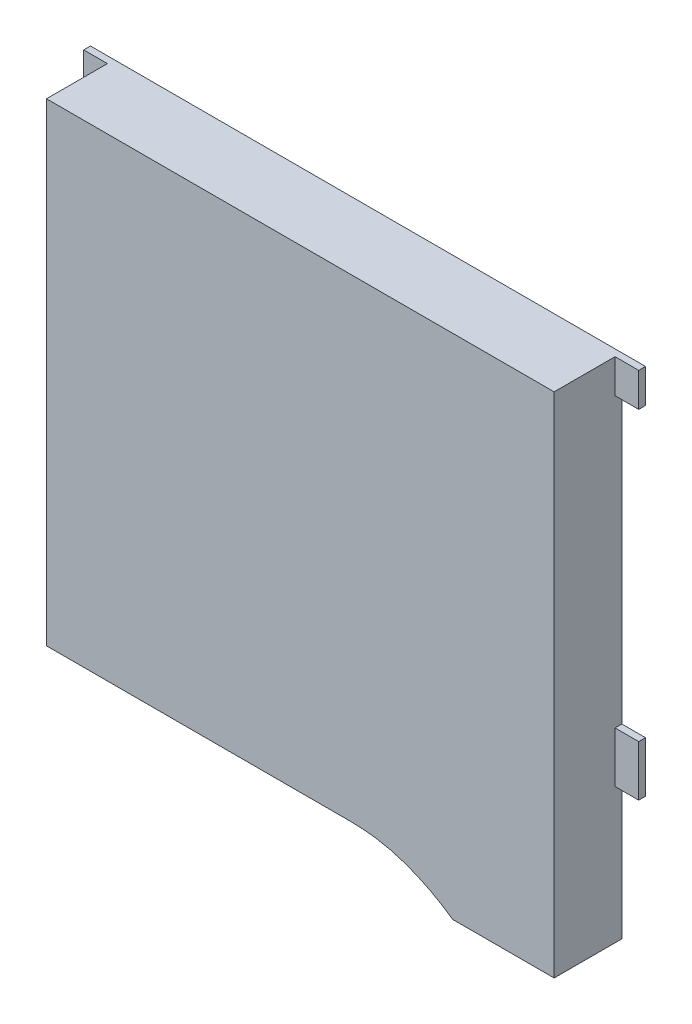
ISO-10303-21;
HEADER;
FILE_DESCRIPTION(('STEP AP214'),'2;1');
FILE_NAME('part.step','',(''),(''),'','','');
FILE_SCHEMA(('AUTOMOTIVE_DESIGN { 1 0 10303 214 1 1 1 1 }'));
ENDSEC;
DATA;
#1=APPLICATION_CONTEXT('core data for automotive mechanical design processes');
#2=APPLICATION_PROTOCOL_DEFINITION('international standard','automotive_design',2000,#1);
#3=PRODUCT_CONTEXT('',#1,'mechanical');
#4=PRODUCT('Part','Part','',(#3));
#5=PRODUCT_RELATED_PRODUCT_CATEGORY('part','',(#4));
#6=PRODUCT_DEFINITION_FORMATION('','',#4);
#7=PRODUCT_DEFINITION_CONTEXT('part definition',#1,'design');
#8=PRODUCT_DEFINITION('design','',#6,#7);
#9=PRODUCT_DEFINITION_SHAPE('','',#8);
#10=(LENGTH_UNIT() NAMED_UNIT(*) SI_UNIT(.MILLI.,.METRE.));
#11=(NAMED_UNIT(*) PLANE_ANGLE_UNIT() SI_UNIT($,.RADIAN.));
#12=(NAMED_UNIT(*) SI_UNIT($,.STERADIAN.) SOLID_ANGLE_UNIT());
#13=UNCERTAINTY_MEASURE_WITH_UNIT(LENGTH_MEASURE(1.E-05),#10,'distance_accuracy_value','');
#14=(GEOMETRIC_REPRESENTATION_CONTEXT(3) GLOBAL_UNCERTAINTY_ASSIGNED_CONTEXT((#13)) GLOBAL_UNIT_ASSIGNED_CONTEXT((#10,
#11,#12)) REPRESENTATION_CONTEXT('',''));
#15=CARTESIAN_POINT('',(0.,0.,0.));
#16=DIRECTION('',(0.,0.,1.));
#17=DIRECTION('',(1.,0.,0.));
#18=AXIS2_PLACEMENT_3D('',#15,#16,#17);
#19=CARTESIAN_POINT('',(7.5,7.5,2.));
#20=DIRECTION('',(-1.,0.,0.));
#21=DIRECTION('',(0.,-1.,0.));
#22=AXIS2_PLACEMENT_3D('',#19,#20,#21);
#23=PLANE('',#22);
#24=DIRECTION('',(0.,0.,-1.));
#25=VECTOR('',#24,1.);
#26=CARTESIAN_POINT('',(7.5,-3.5,0.2));
#27=LINE('',#26,#25);
#28=CARTESIAN_POINT('',(7.5,-3.5,0.2));
#29=VERTEX_POINT('',#28);
#30=CARTESIAN_POINT('',(7.5,-3.5,0.));
#31=VERTEX_POINT('',#30);
#32=EDGE_CURVE('E53',#29,#31,#27,.T.);
#33=ORIENTED_EDGE('',*,*,#32,.F.);
#34=DIRECTION('',(0.,-1.,0.));
#35=VECTOR('',#34,1.);
#36=CARTESIAN_POINT('',(7.5,-2.,0.2));
#37=LINE('',#36,#35);
#38=CARTESIAN_POINT('',(7.5,-2.,0.2));
#39=VERTEX_POINT('',#38);
#40=EDGE_CURVE('E48',#39,#29,#37,.T.);
#41=ORIENTED_EDGE('',*,*,#40,.F.);
#42=DIRECTION('',(0.,0.,-1.));
#43=VECTOR('',#42,1.);
#44=CARTESIAN_POINT('',(7.5,-2.,0.2));
#45=LINE('',#44,#43);
#46=CARTESIAN_POINT('',(7.5,-2.,0.));
#47=VERTEX_POINT('',#46);
#48=EDGE_CURVE('E220',#39,#47,#45,.T.);
#49=ORIENTED_EDGE('',*,*,#48,.T.);
#50=DIRECTION('',(0.,1.,0.));
#51=VECTOR('',#50,1.);
#52=CARTESIAN_POINT('',(7.5,7.5,0.));
#53=LINE('',#52,#51);
#54=CARTESIAN_POINT('',(7.5,6.5,0.));
#55=VERTEX_POINT('',#54);
#56=EDGE_CURVE('E655',#47,#55,#53,.T.);
#57=ORIENTED_EDGE('',*,*,#56,.T.);
#58=DIRECTION('',(0.,0.,-1.));
#59=VECTOR('',#58,1.);
#60=CARTESIAN_POINT('',(7.5,6.5,0.2));
#61=LINE('',#60,#59);
#62=CARTESIAN_POINT('',(7.5,6.5,0.2));
#63=VERTEX_POINT('',#62);
#64=EDGE_CURVE('E305',#63,#55,#61,.T.);
#65=ORIENTED_EDGE('',*,*,#64,.F.);
#66=DIRECTION('',(0.,-1.,0.));
#67=VECTOR('',#66,1.);
#68=CARTESIAN_POINT('',(7.5,6.5,0.2));
#69=LINE('',#68,#67);
#70=CARTESIAN_POINT('',(7.5,7.5,0.2));
#71=VERTEX_POINT('',#70);
#72=EDGE_CURVE('E285',#71,#63,#69,.T.);
#73=ORIENTED_EDGE('',*,*,#72,.F.);
#74=DIRECTION('',(0.,0.,-1.));
#75=VECTOR('',#74,1.);
#76=CARTESIAN_POINT('',(7.5,7.5,2.));
#77=LINE('',#76,#75);
#78=CARTESIAN_POINT('',(7.5,7.5,2.));
#79=VERTEX_POINT('',#78);
#80=EDGE_CURVE('E661',#79,#71,#77,.T.);
#81=ORIENTED_EDGE('',*,*,#80,.F.);
#82=DIRECTION('',(0.,1.,0.));
#83=VECTOR('',#82,1.);
#84=CARTESIAN_POINT('',(7.5,7.5,2.));
#85=LINE('',#84,#83);
#86=CARTESIAN_POINT('',(7.5,-7.5,2.));
#87=VERTEX_POINT('',#86);
#88=EDGE_CURVE('E660',#87,#79,#85,.T.);
#89=ORIENTED_EDGE('',*,*,#88,.F.);
#90=DIRECTION('',(0.,0.,-1.));
#91=VECTOR('',#90,1.);
#92=CARTESIAN_POINT('',(7.5,-7.5,2.));
#93=LINE('',#92,#91);
#94=CARTESIAN_POINT('',(7.5,-7.5,0.));
#95=VERTEX_POINT('',#94);
#96=EDGE_CURVE('E647',#87,#95,#93,.T.);
#97=ORIENTED_EDGE('',*,*,#96,.T.);
#98=EDGE_CURVE('E658',#95,#31,#53,.T.);
#99=ORIENTED_EDGE('',*,*,#98,.T.);
#100=EDGE_LOOP('',(#33,#41,#49,#57,#65,#73,#81,#89,#97,#99));
#101=FACE_BOUND('',#100,.T.);
#102=ADVANCED_FACE('F33',(#101),#23,.F.);
#103=CARTESIAN_POINT('',(-7.5,7.5,2.));
#104=DIRECTION('',(1.,0.,0.));
#105=DIRECTION('',(0.,1.,0.));
#106=AXIS2_PLACEMENT_3D('',#103,#104,#105);
#107=PLANE('',#106);
#108=DIRECTION('',(0.,0.,-1.));
#109=VECTOR('',#108,1.);
#110=CARTESIAN_POINT('',(-7.5,-2.,0.2));
#111=LINE('',#110,#109);
#112=CARTESIAN_POINT('',(-7.5,-2.,0.2));
#113=VERTEX_POINT('',#112);
#114=CARTESIAN_POINT('',(-7.5,-2.,0.));
#115=VERTEX_POINT('',#114);
#116=EDGE_CURVE('E259',#113,#115,#111,.T.);
#117=ORIENTED_EDGE('',*,*,#116,.F.);
#118=DIRECTION('',(0.,1.,0.));
#119=VECTOR('',#118,1.);
#120=CARTESIAN_POINT('',(-7.5,-2.,0.2));
#121=LINE('',#120,#119);
#122=CARTESIAN_POINT('',(-7.5,-3.5,0.2));
#123=VERTEX_POINT('',#122);
#124=EDGE_CURVE('E234',#123,#113,#121,.T.);
#125=ORIENTED_EDGE('',*,*,#124,.F.);
#126=DIRECTION('',(0.,0.,-1.));
#127=VECTOR('',#126,1.);
#128=CARTESIAN_POINT('',(-7.5,-3.5,0.2));
#129=LINE('',#128,#127);
#130=CARTESIAN_POINT('',(-7.5,-3.5,0.));
#131=VERTEX_POINT('',#130);
#132=EDGE_CURVE('E245',#123,#131,#129,.T.);
#133=ORIENTED_EDGE('',*,*,#132,.T.);
#134=DIRECTION('',(0.,-1.,0.));
#135=VECTOR('',#134,1.);
#136=CARTESIAN_POINT('',(-7.5,7.5,0.));
#137=LINE('',#136,#135);
#138=CARTESIAN_POINT('',(-7.5,-6.5,0.));
#139=VERTEX_POINT('',#138);
#140=EDGE_CURVE('E339',#131,#139,#137,.T.);
#141=ORIENTED_EDGE('',*,*,#140,.T.);
#142=DIRECTION('',(0.,0.,-1.));
#143=VECTOR('',#142,1.);
#144=CARTESIAN_POINT('',(-7.5,-6.5,2.));
#145=LINE('',#144,#143);
#146=CARTESIAN_POINT('',(-7.5,-6.5,2.));
#147=VERTEX_POINT('',#146);
#148=EDGE_CURVE('E681',#147,#139,#145,.T.);
#149=ORIENTED_EDGE('',*,*,#148,.F.);
#150=DIRECTION('',(0.,-1.,0.));
#151=VECTOR('',#150,1.);
#152=CARTESIAN_POINT('',(-7.5,7.5,2.));
#153=LINE('',#152,#151);
#154=CARTESIAN_POINT('',(-7.5,7.5,2.));
#155=VERTEX_POINT('',#154);
#156=EDGE_CURVE('E340',#155,#147,#153,.T.);
#157=ORIENTED_EDGE('',*,*,#156,.F.);
#158=DIRECTION('',(0.,0.,-1.));
#159=VECTOR('',#158,1.);
#160=CARTESIAN_POINT('',(-7.5,7.5,2.));
#161=LINE('',#160,#159);
#162=CARTESIAN_POINT('',(-7.5,7.5,0.2));
#163=VERTEX_POINT('',#162);
#164=EDGE_CURVE('E668',#155,#163,#161,.T.);
#165=ORIENTED_EDGE('',*,*,#164,.T.);
#166=DIRECTION('',(0.,1.,0.));
#167=VECTOR('',#166,1.);
#168=CARTESIAN_POINT('',(-7.5,7.5,0.2));
#169=LINE('',#168,#167);
#170=CARTESIAN_POINT('',(-7.5,6.5,0.2));
#171=VERTEX_POINT('',#170);
#172=EDGE_CURVE('E263',#171,#163,#169,.T.);
#173=ORIENTED_EDGE('',*,*,#172,.F.);
#174=DIRECTION('',(0.,0.,-1.));
#175=VECTOR('',#174,1.);
#176=CARTESIAN_POINT('',(-7.5,6.5,0.2));
#177=LINE('',#176,#175);
#178=CARTESIAN_POINT('',(-7.5,6.5,0.));
#179=VERTEX_POINT('',#178);
#180=EDGE_CURVE('E273',#171,#179,#177,.T.);
#181=ORIENTED_EDGE('',*,*,#180,.T.);
#182=EDGE_CURVE('E702',#179,#115,#137,.T.);
#183=ORIENTED_EDGE('',*,*,#182,.T.);
#184=EDGE_LOOP('',(#117,#125,#133,#141,#149,#157,#165,#173,#181,#183));
#185=FACE_BOUND('',#184,.T.);
#186=ADVANCED_FACE('F35',(#185),#107,.F.);
#187=CARTESIAN_POINT('',(1.5,-6.5,2.));
#188=CARTESIAN_POINT('',(3.08113883008419,-6.5,2.));
#189=CARTESIAN_POINT('',(4.5,-7.5,2.));
#190=B_SPLINE_CURVE_WITH_KNOTS('',2,(#187,#188,#189),.UNSPECIFIED.,.F.,.F.,(3,3),(0.,1.),.UNSPECIFIED.);
#191=DIRECTION('',(0.,0.,-1.));
#192=VECTOR('',#191,1.);
#193=SURFACE_OF_LINEAR_EXTRUSION('',#190,#192);
#194=DIRECTION('',(0.,0.,-1.));
#195=VECTOR('',#194,1.);
#196=CARTESIAN_POINT('',(1.5,-6.5,2.));
#197=LINE('',#196,#195);
#198=CARTESIAN_POINT('',(1.5,-6.5,2.));
#199=VERTEX_POINT('',#198);
#200=CARTESIAN_POINT('',(1.5,-6.5,1.8));
#201=VERTEX_POINT('',#200);
#202=EDGE_CURVE('E678',#199,#201,#197,.T.);
#203=ORIENTED_EDGE('',*,*,#202,.T.);
#204=CARTESIAN_POINT('',(1.5,-6.5,1.8));
#205=CARTESIAN_POINT('',(3.08113883008419,-6.5,1.8));
#206=CARTESIAN_POINT('',(4.5,-7.5,1.8));
#207=B_SPLINE_CURVE_WITH_KNOTS('',2,(#204,#205,#206),.UNSPECIFIED.,.F.,.F.,(3,3),(0.,1.),.UNSPECIFIED.);
#208=CARTESIAN_POINT('',(4.5,-7.5,1.8));
#209=VERTEX_POINT('',#208);
#210=EDGE_CURVE('E41',#201,#209,#207,.T.);
#211=ORIENTED_EDGE('',*,*,#210,.T.);
#212=DIRECTION('',(0.,0.,-1.));
#213=VECTOR('',#212,1.);
#214=CARTESIAN_POINT('',(4.5,-7.5,2.));
#215=LINE('',#214,#213);
#216=CARTESIAN_POINT('',(4.5,-7.5,2.));
#217=VERTEX_POINT('',#216);
#218=EDGE_CURVE('E674',#217,#209,#215,.T.);
#219=ORIENTED_EDGE('',*,*,#218,.F.);
#220=EDGE_CURVE('E346',#199,#217,#190,.T.);
#221=ORIENTED_EDGE('',*,*,#220,.F.);
#222=EDGE_LOOP('',(#203,#211,#219,#221));
#223=FACE_BOUND('',#222,.T.);
#224=ADVANCED_FACE('F363',(#223),#193,.F.);
#225=CARTESIAN_POINT('',(-7.5,-6.5,2.));
#226=DIRECTION('',(0.,1.,0.));
#227=DIRECTION('',(-1.,0.,0.));
#228=AXIS2_PLACEMENT_3D('',#225,#226,#227);
#229=PLANE('',#228);
#230=DIRECTION('',(0.,0.,1.));
#231=VECTOR('',#230,1.);
#232=CARTESIAN_POINT('',(-6.5,-6.5,2.));
#233=LINE('',#232,#231);
#234=CARTESIAN_POINT('',(-6.5,-6.5,0.7));
#235=VERTEX_POINT('',#234);
#236=CARTESIAN_POINT('',(-6.5,-6.5,1.8));
#237=VERTEX_POINT('',#236);
#238=EDGE_CURVE('E11',#235,#237,#233,.T.);
#239=ORIENTED_EDGE('',*,*,#238,.T.);
#240=DIRECTION('',(1.,0.,0.));
#241=VECTOR('',#240,1.);
#242=CARTESIAN_POINT('',(-7.5,-6.5,1.8));
#243=LINE('',#242,#241);
#244=EDGE_CURVE('E336',#237,#201,#243,.T.);
#245=ORIENTED_EDGE('',*,*,#244,.T.);
#246=ORIENTED_EDGE('',*,*,#202,.F.);
#247=DIRECTION('',(1.,0.,0.));
#248=VECTOR('',#247,1.);
#249=CARTESIAN_POINT('',(-7.5,-6.5,2.));
#250=LINE('',#249,#248);
#251=EDGE_CURVE('E343',#147,#199,#250,.T.);
#252=ORIENTED_EDGE('',*,*,#251,.F.);
#253=ORIENTED_EDGE('',*,*,#148,.T.);
#254=DIRECTION('',(1.,0.,0.));
#255=VECTOR('',#254,1.);
#256=CARTESIAN_POINT('',(-7.5,-6.5,0.));
#257=LINE('',#256,#255);
#258=CARTESIAN_POINT('',(1.5,-6.5,0.));
#259=VERTEX_POINT('',#258);
#260=EDGE_CURVE('E704',#139,#259,#257,.T.);
#261=ORIENTED_EDGE('',*,*,#260,.T.);
#262=CARTESIAN_POINT('',(1.5,-6.5,0.7));
#263=VERTEX_POINT('',#262);
#264=EDGE_CURVE('E677',#263,#259,#197,.T.);
#265=ORIENTED_EDGE('',*,*,#264,.F.);
#266=DIRECTION('',(-1.,0.,0.));
#267=VECTOR('',#266,1.);
#268=CARTESIAN_POINT('',(-7.5,-6.5,0.7));
#269=LINE('',#268,#267);
#270=EDGE_CURVE('E327',#263,#235,#269,.T.);
#271=ORIENTED_EDGE('',*,*,#270,.T.);
#272=EDGE_LOOP('',(#239,#245,#246,#252,#253,#261,#265,#271));
#273=FACE_BOUND('',#272,.T.);
#274=ADVANCED_FACE('F361',(#273),#229,.F.);
#275=CARTESIAN_POINT('',(4.5,-7.5,0.7));
#276=VERTEX_POINT('',#275);
#277=CARTESIAN_POINT('',(4.5,-7.5,0.));
#278=VERTEX_POINT('',#277);
#279=EDGE_CURVE('E651',#276,#278,#215,.T.);
#280=ORIENTED_EDGE('',*,*,#279,.F.);
#281=CARTESIAN_POINT('',(1.5,-6.5,0.7));
#282=CARTESIAN_POINT('',(3.08113883008419,-6.5,0.7));
#283=CARTESIAN_POINT('',(4.5,-7.5,0.7));
#284=B_SPLINE_CURVE_WITH_KNOTS('',2,(#281,#282,#283),.UNSPECIFIED.,.F.,.F.,(3,3),(0.,1.),.UNSPECIFIED.);
#285=EDGE_CURVE('E684',#276,#263,#284,.F.);
#286=ORIENTED_EDGE('',*,*,#285,.T.);
#287=ORIENTED_EDGE('',*,*,#264,.T.);
#288=CARTESIAN_POINT('',(1.5,-6.5,0.));
#289=CARTESIAN_POINT('',(3.08113883008419,-6.5,0.));
#290=CARTESIAN_POINT('',(4.5,-7.5,0.));
#291=B_SPLINE_CURVE_WITH_KNOTS('',2,(#288,#289,#290),.UNSPECIFIED.,.F.,.F.,(3,3),(0.,1.),.UNSPECIFIED.);
#292=EDGE_CURVE('E656',#259,#278,#291,.T.);
#293=ORIENTED_EDGE('',*,*,#292,.T.);
#294=EDGE_LOOP('',(#280,#286,#287,#293));
#295=FACE_BOUND('',#294,.T.);
#296=ADVANCED_FACE('F357',(#295),#193,.F.);
#297=CARTESIAN_POINT('',(7.5,-7.5,2.));
#298=DIRECTION('',(0.,1.,0.));
#299=DIRECTION('',(-1.,0.,0.));
#300=AXIS2_PLACEMENT_3D('',#297,#298,#299);
#301=PLANE('',#300);
#302=DIRECTION('',(1.,0.,0.));
#303=VECTOR('',#302,1.);
#304=CARTESIAN_POINT('',(7.5,-7.5,0.));
#305=LINE('',#304,#303);
#306=EDGE_CURVE('E644',#278,#95,#305,.T.);
#307=ORIENTED_EDGE('',*,*,#306,.T.);
#308=ORIENTED_EDGE('',*,*,#96,.F.);
#309=DIRECTION('',(1.,0.,0.));
#310=VECTOR('',#309,1.);
#311=CARTESIAN_POINT('',(7.5,-7.5,2.));
#312=LINE('',#311,#310);
#313=EDGE_CURVE('E351',#217,#87,#312,.T.);
#314=ORIENTED_EDGE('',*,*,#313,.F.);
#315=ORIENTED_EDGE('',*,*,#218,.T.);
#316=DIRECTION('',(0.,0.,1.));
#317=VECTOR('',#316,1.);
#318=CARTESIAN_POINT('',(4.5,-7.5,1.8));
#319=LINE('',#318,#317);
#320=EDGE_CURVE('E308',#276,#209,#319,.T.);
#321=ORIENTED_EDGE('',*,*,#320,.F.);
#322=ORIENTED_EDGE('',*,*,#279,.T.);
#323=EDGE_LOOP('',(#307,#308,#314,#315,#321,#322));
#324=FACE_BOUND('',#323,.T.);
#325=ADVANCED_FACE('F360',(#324),#301,.F.);
#326=CARTESIAN_POINT('',(-7.5,7.5,2.));
#327=DIRECTION('',(0.,-1.,0.));
#328=DIRECTION('',(0.,0.,-1.));
#329=AXIS2_PLACEMENT_3D('',#326,#327,#328);
#330=PLANE('',#329);
#331=DIRECTION('',(-1.,0.,0.));
#332=VECTOR('',#331,1.);
#333=CARTESIAN_POINT('',(-7.5,7.5,0.));
#334=LINE('',#333,#332);
#335=CARTESIAN_POINT('',(8.2,7.5,0.));
#336=VERTEX_POINT('',#335);
#337=CARTESIAN_POINT('',(-8.2,7.5,0.));
#338=VERTEX_POINT('',#337);
#339=EDGE_CURVE('E344',#336,#338,#334,.T.);
#340=ORIENTED_EDGE('',*,*,#339,.T.);
#341=DIRECTION('',(0.,0.,-1.));
#342=VECTOR('',#341,1.);
#343=CARTESIAN_POINT('',(-8.2,7.5,0.2));
#344=LINE('',#343,#342);
#345=CARTESIAN_POINT('',(-8.2,7.5,0.2));
#346=VERTEX_POINT('',#345);
#347=EDGE_CURVE('E281',#346,#338,#344,.T.);
#348=ORIENTED_EDGE('',*,*,#347,.F.);
#349=DIRECTION('',(-1.,0.,0.));
#350=VECTOR('',#349,1.);
#351=CARTESIAN_POINT('',(-7.5,7.5,0.2));
#352=LINE('',#351,#350);
#353=EDGE_CURVE('E266',#163,#346,#352,.T.);
#354=ORIENTED_EDGE('',*,*,#353,.F.);
#355=ORIENTED_EDGE('',*,*,#164,.F.);
#356=DIRECTION('',(-1.,0.,0.));
#357=VECTOR('',#356,1.);
#358=CARTESIAN_POINT('',(-7.5,7.5,2.));
#359=LINE('',#358,#357);
#360=EDGE_CURVE('E671',#79,#155,#359,.T.);
#361=ORIENTED_EDGE('',*,*,#360,.F.);
#362=ORIENTED_EDGE('',*,*,#80,.T.);
#363=DIRECTION('',(-1.,0.,0.));
#364=VECTOR('',#363,1.);
#365=CARTESIAN_POINT('',(7.5,7.5,0.2));
#366=LINE('',#365,#364);
#367=CARTESIAN_POINT('',(8.2,7.5,0.2));
#368=VERTEX_POINT('',#367);
#369=EDGE_CURVE('E293',#368,#71,#366,.T.);
#370=ORIENTED_EDGE('',*,*,#369,.F.);
#371=DIRECTION('',(0.,0.,-1.));
#372=VECTOR('',#371,1.);
#373=CARTESIAN_POINT('',(8.2,7.5,0.2));
#374=LINE('',#373,#372);
#375=EDGE_CURVE('E296',#368,#336,#374,.T.);
#376=ORIENTED_EDGE('',*,*,#375,.T.);
#377=EDGE_LOOP('',(#340,#348,#354,#355,#361,#362,#370,#376));
#378=FACE_BOUND('',#377,.T.);
#379=ADVANCED_FACE('F377',(#378),#330,.F.);
#380=CARTESIAN_POINT('',(3.0405694150421,-6.75,2.));
#381=DIRECTION('',(0.,0.,1.));
#382=DIRECTION('',(1.,0.,0.));
#383=AXIS2_PLACEMENT_3D('',#380,#381,#382);
#384=PLANE('',#383);
#385=ORIENTED_EDGE('',*,*,#156,.T.);
#386=ORIENTED_EDGE('',*,*,#251,.T.);
#387=ORIENTED_EDGE('',*,*,#220,.T.);
#388=ORIENTED_EDGE('',*,*,#313,.T.);
#389=ORIENTED_EDGE('',*,*,#88,.T.);
#390=ORIENTED_EDGE('',*,*,#360,.T.);
#391=EDGE_LOOP('',(#385,#386,#387,#388,#389,#390));
#392=FACE_BOUND('',#391,.T.);
#393=ADVANCED_FACE('F380',(#392),#384,.T.);
#394=CARTESIAN_POINT('',(3.0405694150421,-6.75,0.));
#395=DIRECTION('',(0.,0.,1.));
#396=DIRECTION('',(1.,0.,0.));
#397=AXIS2_PLACEMENT_3D('',#394,#395,#396);
#398=PLANE('',#397);
#399=ORIENTED_EDGE('',*,*,#182,.F.);
#400=DIRECTION('',(1.,0.,0.));
#401=VECTOR('',#400,1.);
#402=CARTESIAN_POINT('',(-7.5,6.5,0.));
#403=LINE('',#402,#401);
#404=CARTESIAN_POINT('',(-8.2,6.5,0.));
#405=VERTEX_POINT('',#404);
#406=EDGE_CURVE('E267',#405,#179,#403,.T.);
#407=ORIENTED_EDGE('',*,*,#406,.F.);
#408=DIRECTION('',(0.,-1.,0.));
#409=VECTOR('',#408,1.);
#410=CARTESIAN_POINT('',(-8.2,7.5,0.));
#411=LINE('',#410,#409);
#412=EDGE_CURVE('E262',#338,#405,#411,.T.);
#413=ORIENTED_EDGE('',*,*,#412,.F.);
#414=ORIENTED_EDGE('',*,*,#339,.F.);
#415=DIRECTION('',(0.,1.,0.));
#416=VECTOR('',#415,1.);
#417=CARTESIAN_POINT('',(8.2,7.5,0.));
#418=LINE('',#417,#416);
#419=CARTESIAN_POINT('',(8.2,6.5,0.));
#420=VERTEX_POINT('',#419);
#421=EDGE_CURVE('E289',#420,#336,#418,.T.);
#422=ORIENTED_EDGE('',*,*,#421,.F.);
#423=DIRECTION('',(1.,0.,0.));
#424=VECTOR('',#423,1.);
#425=CARTESIAN_POINT('',(8.2,6.5,0.));
#426=LINE('',#425,#424);
#427=EDGE_CURVE('E284',#55,#420,#426,.T.);
#428=ORIENTED_EDGE('',*,*,#427,.F.);
#429=ORIENTED_EDGE('',*,*,#56,.F.);
#430=DIRECTION('',(-1.,0.,0.));
#431=VECTOR('',#430,1.);
#432=CARTESIAN_POINT('',(7.5,-2.,0.));
#433=LINE('',#432,#431);
#434=CARTESIAN_POINT('',(8.2,-2.,0.));
#435=VERTEX_POINT('',#434);
#436=EDGE_CURVE('E227',#435,#47,#433,.T.);
#437=ORIENTED_EDGE('',*,*,#436,.F.);
#438=DIRECTION('',(0.,1.,0.));
#439=VECTOR('',#438,1.);
#440=CARTESIAN_POINT('',(8.2,-2.,0.));
#441=LINE('',#440,#439);
#442=CARTESIAN_POINT('',(8.2,-3.5,0.));
#443=VERTEX_POINT('',#442);
#444=EDGE_CURVE('E225',#443,#435,#441,.T.);
#445=ORIENTED_EDGE('',*,*,#444,.F.);
#446=DIRECTION('',(1.,0.,0.));
#447=VECTOR('',#446,1.);
#448=CARTESIAN_POINT('',(7.5,-3.5,0.));
#449=LINE('',#448,#447);
#450=EDGE_CURVE('E210',#31,#443,#449,.T.);
#451=ORIENTED_EDGE('',*,*,#450,.F.);
#452=ORIENTED_EDGE('',*,*,#98,.F.);
#453=ORIENTED_EDGE('',*,*,#306,.F.);
#454=ORIENTED_EDGE('',*,*,#292,.F.);
#455=ORIENTED_EDGE('',*,*,#260,.F.);
#456=ORIENTED_EDGE('',*,*,#140,.F.);
#457=DIRECTION('',(1.,0.,0.));
#458=VECTOR('',#457,1.);
#459=CARTESIAN_POINT('',(-7.5,-3.5,0.));
#460=LINE('',#459,#458);
#461=CARTESIAN_POINT('',(-8.2,-3.5,0.));
#462=VERTEX_POINT('',#461);
#463=EDGE_CURVE('E238',#462,#131,#460,.T.);
#464=ORIENTED_EDGE('',*,*,#463,.F.);
#465=DIRECTION('',(0.,-1.,0.));
#466=VECTOR('',#465,1.);
#467=CARTESIAN_POINT('',(-8.2,-2.,0.));
#468=LINE('',#467,#466);
#469=CARTESIAN_POINT('',(-8.2,-2.,0.));
#470=VERTEX_POINT('',#469);
#471=EDGE_CURVE('E247',#470,#462,#468,.T.);
#472=ORIENTED_EDGE('',*,*,#471,.F.);
#473=DIRECTION('',(-1.,0.,0.));
#474=VECTOR('',#473,1.);
#475=CARTESIAN_POINT('',(-7.5,-2.,0.));
#476=LINE('',#475,#474);
#477=EDGE_CURVE('E233',#115,#470,#476,.T.);
#478=ORIENTED_EDGE('',*,*,#477,.F.);
#479=EDGE_LOOP('',(#399,#407,#413,#414,#422,#428,#429,#437,#445,#451,#452,#453,#454,#455,#456,
#464,#472,#478));
#480=FACE_BOUND('',#479,.T.);
#481=ADVANCED_FACE('F382',(#480),#398,.F.);
#482=CARTESIAN_POINT('',(-6.5,4.49999999999999,1.8));
#483=DIRECTION('',(-1.,0.,0.));
#484=DIRECTION('',(0.,-1.,0.));
#485=AXIS2_PLACEMENT_3D('',#482,#483,#484);
#486=PLANE('',#485);
#487=DIRECTION('',(0.,-1.,0.));
#488=VECTOR('',#487,1.);
#489=CARTESIAN_POINT('',(-6.5,4.49999999999999,0.7));
#490=LINE('',#489,#488);
#491=CARTESIAN_POINT('',(-6.5,4.49999999999999,0.7));
#492=VERTEX_POINT('',#491);
#493=EDGE_CURVE('E321',#492,#235,#490,.T.);
#494=ORIENTED_EDGE('',*,*,#493,.F.);
#495=DIRECTION('',(0.,0.,-1.));
#496=VECTOR('',#495,1.);
#497=CARTESIAN_POINT('',(-6.5,4.49999999999999,1.8));
#498=LINE('',#497,#496);
#499=CARTESIAN_POINT('',(-6.5,4.49999999999999,1.8));
#500=VERTEX_POINT('',#499);
#501=EDGE_CURVE('E309',#500,#492,#498,.T.);
#502=ORIENTED_EDGE('',*,*,#501,.F.);
#503=DIRECTION('',(0.,-1.,0.));
#504=VECTOR('',#503,1.);
#505=CARTESIAN_POINT('',(-6.5,4.49999999999999,1.8));
#506=LINE('',#505,#504);
#507=EDGE_CURVE('E324',#500,#237,#506,.T.);
#508=ORIENTED_EDGE('',*,*,#507,.T.);
#509=ORIENTED_EDGE('',*,*,#238,.F.);
#510=EDGE_LOOP('',(#494,#502,#508,#509));
#511=FACE_BOUND('',#510,.T.);
#512=ADVANCED_FACE('F385',(#511),#486,.F.);
#513=CARTESIAN_POINT('',(-6.5,4.49999999999999,1.8));
#514=DIRECTION('',(0.,0.,1.));
#515=DIRECTION('',(1.,0.,0.));
#516=AXIS2_PLACEMENT_3D('',#513,#514,#515);
#517=PLANE('',#516);
#518=ORIENTED_EDGE('',*,*,#507,.F.);
#519=DIRECTION('',(-1.,0.,0.));
#520=VECTOR('',#519,1.);
#521=CARTESIAN_POINT('',(-6.5,4.49999999999999,1.8));
#522=LINE('',#521,#520);
#523=CARTESIAN_POINT('',(4.49999999999999,4.5,1.8));
#524=VERTEX_POINT('',#523);
#525=EDGE_CURVE('E318',#524,#500,#522,.T.);
#526=ORIENTED_EDGE('',*,*,#525,.F.);
#527=DIRECTION('',(0.,-1.,0.));
#528=VECTOR('',#527,1.);
#529=CARTESIAN_POINT('',(4.49999999999999,4.5,1.8));
#530=LINE('',#529,#528);
#531=EDGE_CURVE('E328',#524,#209,#530,.T.);
#532=ORIENTED_EDGE('',*,*,#531,.T.);
#533=ORIENTED_EDGE('',*,*,#210,.F.);
#534=ORIENTED_EDGE('',*,*,#244,.F.);
#535=EDGE_LOOP('',(#518,#526,#532,#533,#534));
#536=FACE_BOUND('',#535,.T.);
#537=ADVANCED_FACE('F392',(#536),#517,.F.);
#538=CARTESIAN_POINT('',(-6.5,4.49999999999999,0.7));
#539=DIRECTION('',(0.,0.,-1.));
#540=DIRECTION('',(-1.,0.,0.));
#541=AXIS2_PLACEMENT_3D('',#538,#539,#540);
#542=PLANE('',#541);
#543=ORIENTED_EDGE('',*,*,#285,.F.);
#544=DIRECTION('',(0.,-1.,0.));
#545=VECTOR('',#544,1.);
#546=CARTESIAN_POINT('',(4.49999999999999,4.5,0.7));
#547=LINE('',#546,#545);
#548=CARTESIAN_POINT('',(4.49999999999999,4.5,0.7));
#549=VERTEX_POINT('',#548);
#550=EDGE_CURVE('E330',#549,#276,#547,.T.);
#551=ORIENTED_EDGE('',*,*,#550,.F.);
#552=DIRECTION('',(1.,0.,0.));
#553=VECTOR('',#552,1.);
#554=CARTESIAN_POINT('',(-6.5,4.49999999999999,0.7));
#555=LINE('',#554,#553);
#556=EDGE_CURVE('E312',#492,#549,#555,.T.);
#557=ORIENTED_EDGE('',*,*,#556,.F.);
#558=ORIENTED_EDGE('',*,*,#493,.T.);
#559=ORIENTED_EDGE('',*,*,#270,.F.);
#560=EDGE_LOOP('',(#543,#551,#557,#558,#559));
#561=FACE_BOUND('',#560,.T.);
#562=ADVANCED_FACE('F394',(#561),#542,.F.);
#563=CARTESIAN_POINT('',(4.49999999999999,4.5,1.8));
#564=DIRECTION('',(1.,0.,0.));
#565=DIRECTION('',(0.,1.,0.));
#566=AXIS2_PLACEMENT_3D('',#563,#564,#565);
#567=PLANE('',#566);
#568=ORIENTED_EDGE('',*,*,#320,.T.);
#569=ORIENTED_EDGE('',*,*,#531,.F.);
#570=DIRECTION('',(0.,0.,1.));
#571=VECTOR('',#570,1.);
#572=CARTESIAN_POINT('',(4.49999999999999,4.5,1.8));
#573=LINE('',#572,#571);
#574=EDGE_CURVE('E315',#549,#524,#573,.T.);
#575=ORIENTED_EDGE('',*,*,#574,.F.);
#576=ORIENTED_EDGE('',*,*,#550,.T.);
#577=EDGE_LOOP('',(#568,#569,#575,#576));
#578=FACE_BOUND('',#577,.T.);
#579=ADVANCED_FACE('F397',(#578),#567,.F.);
#580=CARTESIAN_POINT('',(0.,4.5,0.));
#581=DIRECTION('',(0.,-1.,0.));
#582=DIRECTION('',(1.,0.,0.));
#583=AXIS2_PLACEMENT_3D('',#580,#581,#582);
#584=PLANE('',#583);
#585=ORIENTED_EDGE('',*,*,#501,.T.);
#586=ORIENTED_EDGE('',*,*,#556,.T.);
#587=ORIENTED_EDGE('',*,*,#574,.T.);
#588=ORIENTED_EDGE('',*,*,#525,.T.);
#589=EDGE_LOOP('',(#585,#586,#587,#588));
#590=FACE_BOUND('',#589,.T.);
#591=ADVANCED_FACE('F401',(#590),#584,.T.);
#592=CARTESIAN_POINT('',(8.2,6.5,0.2));
#593=DIRECTION('',(0.,1.,0.));
#594=DIRECTION('',(-1.,0.,0.));
#595=AXIS2_PLACEMENT_3D('',#592,#593,#594);
#596=PLANE('',#595);
#597=ORIENTED_EDGE('',*,*,#427,.T.);
#598=DIRECTION('',(0.,0.,-1.));
#599=VECTOR('',#598,1.);
#600=CARTESIAN_POINT('',(8.2,6.5,0.2));
#601=LINE('',#600,#599);
#602=CARTESIAN_POINT('',(8.2,6.5,0.2));
#603=VERTEX_POINT('',#602);
#604=EDGE_CURVE('E302',#603,#420,#601,.T.);
#605=ORIENTED_EDGE('',*,*,#604,.F.);
#606=DIRECTION('',(1.,0.,0.));
#607=VECTOR('',#606,1.);
#608=CARTESIAN_POINT('',(8.2,6.5,0.2));
#609=LINE('',#608,#607);
#610=EDGE_CURVE('E288',#63,#603,#609,.T.);
#611=ORIENTED_EDGE('',*,*,#610,.F.);
#612=ORIENTED_EDGE('',*,*,#64,.T.);
#613=EDGE_LOOP('',(#597,#605,#611,#612));
#614=FACE_BOUND('',#613,.T.);
#615=ADVANCED_FACE('F408',(#614),#596,.F.);
#616=CARTESIAN_POINT('',(8.2,7.5,0.2));
#617=DIRECTION('',(-1.,0.,0.));
#618=DIRECTION('',(0.,0.,1.));
#619=AXIS2_PLACEMENT_3D('',#616,#617,#618);
#620=PLANE('',#619);
#621=ORIENTED_EDGE('',*,*,#421,.T.);
#622=ORIENTED_EDGE('',*,*,#375,.F.);
#623=DIRECTION('',(0.,1.,0.));
#624=VECTOR('',#623,1.);
#625=CARTESIAN_POINT('',(8.2,7.5,0.2));
#626=LINE('',#625,#624);
#627=EDGE_CURVE('E291',#603,#368,#626,.T.);
#628=ORIENTED_EDGE('',*,*,#627,.F.);
#629=ORIENTED_EDGE('',*,*,#604,.T.);
#630=EDGE_LOOP('',(#621,#622,#628,#629));
#631=FACE_BOUND('',#630,.T.);
#632=ADVANCED_FACE('F412',(#631),#620,.F.);
#633=CARTESIAN_POINT('',(0.,0.,0.2));
#634=DIRECTION('',(0.,0.,-1.));
#635=DIRECTION('',(-1.,0.,0.));
#636=AXIS2_PLACEMENT_3D('',#633,#634,#635);
#637=PLANE('',#636);
#638=ORIENTED_EDGE('',*,*,#72,.T.);
#639=ORIENTED_EDGE('',*,*,#610,.T.);
#640=ORIENTED_EDGE('',*,*,#627,.T.);
#641=ORIENTED_EDGE('',*,*,#369,.T.);
#642=EDGE_LOOP('',(#638,#639,#640,#641));
#643=FACE_BOUND('',#642,.T.);
#644=ADVANCED_FACE('F416',(#643),#637,.F.);
#645=CARTESIAN_POINT('',(-8.2,7.5,0.2));
#646=DIRECTION('',(1.,0.,0.));
#647=DIRECTION('',(0.,0.,-1.));
#648=AXIS2_PLACEMENT_3D('',#645,#646,#647);
#649=PLANE('',#648);
#650=ORIENTED_EDGE('',*,*,#412,.T.);
#651=DIRECTION('',(0.,0.,-1.));
#652=VECTOR('',#651,1.);
#653=CARTESIAN_POINT('',(-8.2,6.5,0.2));
#654=LINE('',#653,#652);
#655=CARTESIAN_POINT('',(-8.2,6.5,0.2));
#656=VERTEX_POINT('',#655);
#657=EDGE_CURVE('E278',#656,#405,#654,.T.);
#658=ORIENTED_EDGE('',*,*,#657,.F.);
#659=DIRECTION('',(0.,-1.,0.));
#660=VECTOR('',#659,1.);
#661=CARTESIAN_POINT('',(-8.2,7.5,0.2));
#662=LINE('',#661,#660);
#663=EDGE_CURVE('E269',#346,#656,#662,.T.);
#664=ORIENTED_EDGE('',*,*,#663,.F.);
#665=ORIENTED_EDGE('',*,*,#347,.T.);
#666=EDGE_LOOP('',(#650,#658,#664,#665));
#667=FACE_BOUND('',#666,.T.);
#668=ADVANCED_FACE('F420',(#667),#649,.F.);
#669=CARTESIAN_POINT('',(-7.5,6.5,0.2));
#670=DIRECTION('',(0.,1.,0.));
#671=DIRECTION('',(0.,0.,1.));
#672=AXIS2_PLACEMENT_3D('',#669,#670,#671);
#673=PLANE('',#672);
#674=ORIENTED_EDGE('',*,*,#406,.T.);
#675=ORIENTED_EDGE('',*,*,#180,.F.);
#676=DIRECTION('',(1.,0.,0.));
#677=VECTOR('',#676,1.);
#678=CARTESIAN_POINT('',(-7.5,6.5,0.2));
#679=LINE('',#678,#677);
#680=EDGE_CURVE('E271',#656,#171,#679,.T.);
#681=ORIENTED_EDGE('',*,*,#680,.F.);
#682=ORIENTED_EDGE('',*,*,#657,.T.);
#683=EDGE_LOOP('',(#674,#675,#681,#682));
#684=FACE_BOUND('',#683,.T.);
#685=ADVANCED_FACE('F424',(#684),#673,.F.);
#686=CARTESIAN_POINT('',(0.,0.,0.2));
#687=DIRECTION('',(0.,0.,-1.));
#688=DIRECTION('',(-1.,0.,0.));
#689=AXIS2_PLACEMENT_3D('',#686,#687,#688);
#690=PLANE('',#689);
#691=ORIENTED_EDGE('',*,*,#172,.T.);
#692=ORIENTED_EDGE('',*,*,#353,.T.);
#693=ORIENTED_EDGE('',*,*,#663,.T.);
#694=ORIENTED_EDGE('',*,*,#680,.T.);
#695=EDGE_LOOP('',(#691,#692,#693,#694));
#696=FACE_BOUND('',#695,.T.);
#697=ADVANCED_FACE('F428',(#696),#690,.F.);
#698=CARTESIAN_POINT('',(-7.5,-2.,0.2));
#699=DIRECTION('',(0.,-1.,0.));
#700=DIRECTION('',(0.,0.,-1.));
#701=AXIS2_PLACEMENT_3D('',#698,#699,#700);
#702=PLANE('',#701);
#703=ORIENTED_EDGE('',*,*,#477,.T.);
#704=DIRECTION('',(0.,0.,-1.));
#705=VECTOR('',#704,1.);
#706=CARTESIAN_POINT('',(-8.2,-2.,0.2));
#707=LINE('',#706,#705);
#708=CARTESIAN_POINT('',(-8.2,-2.,0.2));
#709=VERTEX_POINT('',#708);
#710=EDGE_CURVE('E256',#709,#470,#707,.T.);
#711=ORIENTED_EDGE('',*,*,#710,.F.);
#712=DIRECTION('',(-1.,0.,0.));
#713=VECTOR('',#712,1.);
#714=CARTESIAN_POINT('',(-7.5,-2.,0.2));
#715=LINE('',#714,#713);
#716=EDGE_CURVE('E237',#113,#709,#715,.T.);
#717=ORIENTED_EDGE('',*,*,#716,.F.);
#718=ORIENTED_EDGE('',*,*,#116,.T.);
#719=EDGE_LOOP('',(#703,#711,#717,#718));
#720=FACE_BOUND('',#719,.T.);
#721=ADVANCED_FACE('F432',(#720),#702,.F.);
#722=CARTESIAN_POINT('',(-8.2,-2.,0.2));
#723=DIRECTION('',(1.,0.,0.));
#724=DIRECTION('',(0.,0.,-1.));
#725=AXIS2_PLACEMENT_3D('',#722,#723,#724);
#726=PLANE('',#725);
#727=ORIENTED_EDGE('',*,*,#471,.T.);
#728=DIRECTION('',(0.,0.,-1.));
#729=VECTOR('',#728,1.);
#730=CARTESIAN_POINT('',(-8.2,-3.5,0.2));
#731=LINE('',#730,#729);
#732=CARTESIAN_POINT('',(-8.2,-3.5,0.2));
#733=VERTEX_POINT('',#732);
#734=EDGE_CURVE('E253',#733,#462,#731,.T.);
#735=ORIENTED_EDGE('',*,*,#734,.F.);
#736=DIRECTION('',(0.,-1.,0.));
#737=VECTOR('',#736,1.);
#738=CARTESIAN_POINT('',(-8.2,-2.,0.2));
#739=LINE('',#738,#737);
#740=EDGE_CURVE('E240',#709,#733,#739,.T.);
#741=ORIENTED_EDGE('',*,*,#740,.F.);
#742=ORIENTED_EDGE('',*,*,#710,.T.);
#743=EDGE_LOOP('',(#727,#735,#741,#742));
#744=FACE_BOUND('',#743,.T.);
#745=ADVANCED_FACE('F436',(#744),#726,.F.);
#746=CARTESIAN_POINT('',(-7.5,-3.5,0.2));
#747=DIRECTION('',(0.,1.,0.));
#748=DIRECTION('',(0.,0.,1.));
#749=AXIS2_PLACEMENT_3D('',#746,#747,#748);
#750=PLANE('',#749);
#751=ORIENTED_EDGE('',*,*,#463,.T.);
#752=ORIENTED_EDGE('',*,*,#132,.F.);
#753=DIRECTION('',(1.,0.,0.));
#754=VECTOR('',#753,1.);
#755=CARTESIAN_POINT('',(-7.5,-3.5,0.2));
#756=LINE('',#755,#754);
#757=EDGE_CURVE('E242',#733,#123,#756,.T.);
#758=ORIENTED_EDGE('',*,*,#757,.F.);
#759=ORIENTED_EDGE('',*,*,#734,.T.);
#760=EDGE_LOOP('',(#751,#752,#758,#759));
#761=FACE_BOUND('',#760,.T.);
#762=ADVANCED_FACE('F440',(#761),#750,.F.);
#763=CARTESIAN_POINT('',(0.,0.,0.2));
#764=DIRECTION('',(0.,0.,-1.));
#765=DIRECTION('',(-1.,0.,0.));
#766=AXIS2_PLACEMENT_3D('',#763,#764,#765);
#767=PLANE('',#766);
#768=ORIENTED_EDGE('',*,*,#124,.T.);
#769=ORIENTED_EDGE('',*,*,#716,.T.);
#770=ORIENTED_EDGE('',*,*,#740,.T.);
#771=ORIENTED_EDGE('',*,*,#757,.T.);
#772=EDGE_LOOP('',(#768,#769,#770,#771));
#773=FACE_BOUND('',#772,.T.);
#774=ADVANCED_FACE('F444',(#773),#767,.F.);
#775=CARTESIAN_POINT('',(7.5,-3.5,0.2));
#776=DIRECTION('',(0.,1.,0.));
#777=DIRECTION('',(-1.,0.,0.));
#778=AXIS2_PLACEMENT_3D('',#775,#776,#777);
#779=PLANE('',#778);
#780=ORIENTED_EDGE('',*,*,#450,.T.);
#781=DIRECTION('',(0.,0.,-1.));
#782=VECTOR('',#781,1.);
#783=CARTESIAN_POINT('',(8.2,-3.5,0.2));
#784=LINE('',#783,#782);
#785=CARTESIAN_POINT('',(8.2,-3.5,0.2));
#786=VERTEX_POINT('',#785);
#787=EDGE_CURVE('E207',#786,#443,#784,.T.);
#788=ORIENTED_EDGE('',*,*,#787,.F.);
#789=DIRECTION('',(1.,0.,0.));
#790=VECTOR('',#789,1.);
#791=CARTESIAN_POINT('',(7.5,-3.5,0.2));
#792=LINE('',#791,#790);
#793=EDGE_CURVE('E198',#29,#786,#792,.T.);
#794=ORIENTED_EDGE('',*,*,#793,.F.);
#795=ORIENTED_EDGE('',*,*,#32,.T.);
#796=EDGE_LOOP('',(#780,#788,#794,#795));
#797=FACE_BOUND('',#796,.T.);
#798=ADVANCED_FACE('F208',(#797),#779,.F.);
#799=CARTESIAN_POINT('',(8.2,-2.,0.2));
#800=DIRECTION('',(-1.,0.,0.));
#801=DIRECTION('',(0.,-1.,0.));
#802=AXIS2_PLACEMENT_3D('',#799,#800,#801);
#803=PLANE('',#802);
#804=ORIENTED_EDGE('',*,*,#444,.T.);
#805=DIRECTION('',(0.,0.,-1.));
#806=VECTOR('',#805,1.);
#807=CARTESIAN_POINT('',(8.2,-2.,0.2));
#808=LINE('',#807,#806);
#809=CARTESIAN_POINT('',(8.2,-2.,0.2));
#810=VERTEX_POINT('',#809);
#811=EDGE_CURVE('E213',#810,#435,#808,.T.);
#812=ORIENTED_EDGE('',*,*,#811,.F.);
#813=DIRECTION('',(0.,1.,0.));
#814=VECTOR('',#813,1.);
#815=CARTESIAN_POINT('',(8.2,-2.,0.2));
#816=LINE('',#815,#814);
#817=EDGE_CURVE('E202',#786,#810,#816,.T.);
#818=ORIENTED_EDGE('',*,*,#817,.F.);
#819=ORIENTED_EDGE('',*,*,#787,.T.);
#820=EDGE_LOOP('',(#804,#812,#818,#819));
#821=FACE_BOUND('',#820,.T.);
#822=ADVANCED_FACE('F215',(#821),#803,.F.);
#823=CARTESIAN_POINT('',(7.5,-2.,0.2));
#824=DIRECTION('',(0.,-1.,0.));
#825=DIRECTION('',(0.,0.,-1.));
#826=AXIS2_PLACEMENT_3D('',#823,#824,#825);
#827=PLANE('',#826);
#828=ORIENTED_EDGE('',*,*,#436,.T.);
#829=ORIENTED_EDGE('',*,*,#48,.F.);
#830=DIRECTION('',(-1.,0.,0.));
#831=VECTOR('',#830,1.);
#832=CARTESIAN_POINT('',(7.5,-2.,0.2));
#833=LINE('',#832,#831);
#834=EDGE_CURVE('E218',#810,#39,#833,.T.);
#835=ORIENTED_EDGE('',*,*,#834,.F.);
#836=ORIENTED_EDGE('',*,*,#811,.T.);
#837=EDGE_LOOP('',(#828,#829,#835,#836));
#838=FACE_BOUND('',#837,.T.);
#839=ADVANCED_FACE('F453',(#838),#827,.F.);
#840=CARTESIAN_POINT('',(0.,0.,0.2));
#841=DIRECTION('',(0.,0.,1.));
#842=DIRECTION('',(1.,0.,0.));
#843=AXIS2_PLACEMENT_3D('',#840,#841,#842);
#844=PLANE('',#843);
#845=ORIENTED_EDGE('',*,*,#40,.T.);
#846=ORIENTED_EDGE('',*,*,#793,.T.);
#847=ORIENTED_EDGE('',*,*,#817,.T.);
#848=ORIENTED_EDGE('',*,*,#834,.T.);
#849=EDGE_LOOP('',(#845,#846,#847,#848));
#850=FACE_BOUND('',#849,.T.);
#851=ADVANCED_FACE('F200',(#850),#844,.T.);
#852=CLOSED_SHELL('',(#102,#186,#224,#274,#296,#325,#379,#393,#481,#512,#537,#562,#579,#591,
#615,#632,#644,#668,#685,#697,#721,#745,#762,#774,#798,#822,#839,#851));
#853=MANIFOLD_SOLID_BREP('B2',#852);
#854=ADVANCED_BREP_SHAPE_REPRESENTATION('',(#18,#853),#14);
#855=SHAPE_DEFINITION_REPRESENTATION(#9,#854);
ENDSEC;
END-ISO-10303-21;
